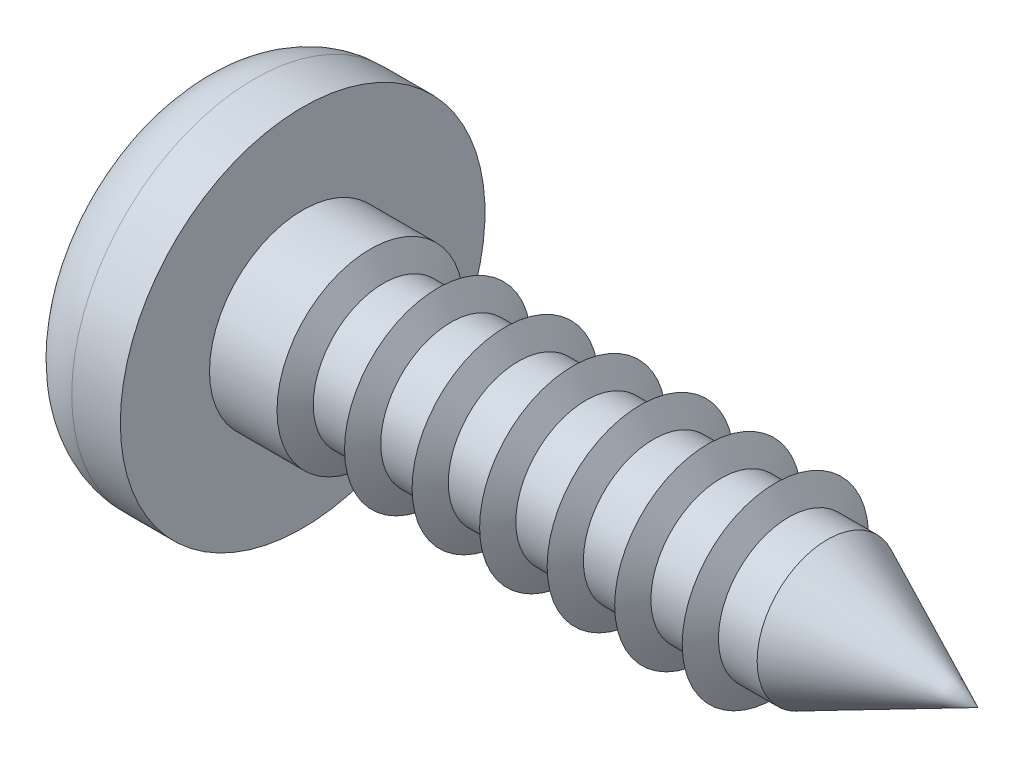
ISO-10303-21;
HEADER;
FILE_DESCRIPTION(('STEP AP214'),'2;1');
FILE_NAME('part.step','',(''),(''),'','','');
FILE_SCHEMA(('AUTOMOTIVE_DESIGN { 1 0 10303 214 1 1 1 1 }'));
ENDSEC;
DATA;
#1=APPLICATION_CONTEXT('core data for automotive mechanical design processes');
#2=APPLICATION_PROTOCOL_DEFINITION('international standard','automotive_design',2000,#1);
#3=PRODUCT_CONTEXT('',#1,'mechanical');
#4=PRODUCT('Part','Part','',(#3));
#5=PRODUCT_RELATED_PRODUCT_CATEGORY('part','',(#4));
#6=PRODUCT_DEFINITION_FORMATION('','',#4);
#7=PRODUCT_DEFINITION_CONTEXT('part definition',#1,'design');
#8=PRODUCT_DEFINITION('design','',#6,#7);
#9=PRODUCT_DEFINITION_SHAPE('','',#8);
#10=(LENGTH_UNIT() NAMED_UNIT(*) SI_UNIT(.MILLI.,.METRE.));
#11=(NAMED_UNIT(*) PLANE_ANGLE_UNIT() SI_UNIT($,.RADIAN.));
#12=(NAMED_UNIT(*) SI_UNIT($,.STERADIAN.) SOLID_ANGLE_UNIT());
#13=UNCERTAINTY_MEASURE_WITH_UNIT(LENGTH_MEASURE(1.E-05),#10,'distance_accuracy_value','');
#14=(GEOMETRIC_REPRESENTATION_CONTEXT(3) GLOBAL_UNCERTAINTY_ASSIGNED_CONTEXT((#13)) GLOBAL_UNIT_ASSIGNED_CONTEXT((#10,
#11,#12)) REPRESENTATION_CONTEXT('',''));
#15=CARTESIAN_POINT('',(0.,0.,0.));
#16=DIRECTION('',(0.,0.,1.));
#17=DIRECTION('',(1.,0.,0.));
#18=AXIS2_PLACEMENT_3D('',#15,#16,#17);
#19=CARTESIAN_POINT('',(7.62,0.,0.));
#20=DIRECTION('',(-1.,0.,0.));
#21=DIRECTION('',(0.,0.,1.));
#22=AXIS2_PLACEMENT_3D('',#19,#20,#21);
#23=CYLINDRICAL_SURFACE('',#22,1.3208);
#24=CARTESIAN_POINT('',(11.2220998462361,0.,0.));
#25=DIRECTION('',(-1.,0.,0.));
#26=DIRECTION('',(0.,0.,1.));
#27=AXIS2_PLACEMENT_3D('',#24,#25,#26);
#28=CIRCLE('',#27,1.3208);
#29=CARTESIAN_POINT('',(11.2220998462361,0.,1.3208));
#30=VERTEX_POINT('',#29);
#31=EDGE_CURVE('E743',#30,#30,#28,.T.);
#32=ORIENTED_EDGE('',*,*,#31,.F.);
#33=EDGE_LOOP('',(#32));
#34=FACE_BOUND('',#33,.T.);
#35=CARTESIAN_POINT('',(11.9503352593909,0.,0.));
#36=DIRECTION('',(-1.,0.,0.));
#37=DIRECTION('',(0.,0.,1.));
#38=AXIS2_PLACEMENT_3D('',#35,#36,#37);
#39=CIRCLE('',#38,1.3208);
#40=CARTESIAN_POINT('',(11.9503352593909,0.,1.3208));
#41=VERTEX_POINT('',#40);
#42=EDGE_CURVE('E78',#41,#41,#39,.T.);
#43=ORIENTED_EDGE('',*,*,#42,.T.);
#44=EDGE_LOOP('',(#43));
#45=FACE_BOUND('',#44,.T.);
#46=ADVANCED_FACE('F74',(#34,#45),#23,.T.);
#47=CARTESIAN_POINT('',(0.,0.,0.));
#48=DIRECTION('',(-1.,0.,0.));
#49=DIRECTION('',(0.,0.,1.));
#50=AXIS2_PLACEMENT_3D('',#47,#48,#49);
#51=CYLINDRICAL_SURFACE('',#50,1.7526);
#52=CARTESIAN_POINT('',(2.0828,0.,0.));
#53=DIRECTION('',(-1.,0.,0.));
#54=DIRECTION('',(0.,0.,1.));
#55=AXIS2_PLACEMENT_3D('',#52,#53,#54);
#56=CIRCLE('',#55,1.7526);
#57=CARTESIAN_POINT('',(2.0828,0.,1.7526));
#58=VERTEX_POINT('',#57);
#59=EDGE_CURVE('E184',#58,#58,#56,.T.);
#60=ORIENTED_EDGE('',*,*,#59,.F.);
#61=EDGE_LOOP('',(#60));
#62=FACE_BOUND('',#61,.T.);
#63=CARTESIAN_POINT('',(3.3528,0.,0.));
#64=DIRECTION('',(-1.,0.,0.));
#65=DIRECTION('',(0.,0.,1.));
#66=AXIS2_PLACEMENT_3D('',#63,#64,#65);
#67=CIRCLE('',#66,1.7526);
#68=CARTESIAN_POINT('',(3.3528,0.,1.7526));
#69=VERTEX_POINT('',#68);
#70=EDGE_CURVE('E188',#69,#69,#67,.T.);
#71=ORIENTED_EDGE('',*,*,#70,.T.);
#72=EDGE_LOOP('',(#71));
#73=FACE_BOUND('',#72,.T.);
#74=ADVANCED_FACE('F325',(#62,#73),#51,.T.);
#75=CARTESIAN_POINT('',(0.,0.,0.));
#76=DIRECTION('',(1.,0.,0.));
#77=DIRECTION('',(0.,0.,-1.));
#78=AXIS2_PLACEMENT_3D('',#75,#76,#77);
#79=PLANE('',#78);
#80=CARTESIAN_POINT('',(0.,0.,0.));
#81=DIRECTION('',(-1.,0.,0.));
#82=DIRECTION('',(0.,0.,1.));
#83=AXIS2_PLACEMENT_3D('',#80,#81,#82);
#84=CIRCLE('',#83,2.2606);
#85=CARTESIAN_POINT('',(0.,0.,2.2606));
#86=VERTEX_POINT('',#85);
#87=EDGE_CURVE('E46',#86,#86,#84,.T.);
#88=ORIENTED_EDGE('',*,*,#87,.T.);
#89=EDGE_LOOP('',(#88));
#90=FACE_BOUND('',#89,.T.);
#91=DIRECTION('',(0.,1.,0.));
#92=VECTOR('',#91,1.);
#93=CARTESIAN_POINT('',(0.,0.4699,-2.1463));
#94=LINE('',#93,#92);
#95=CARTESIAN_POINT('',(0.,-0.4699,-2.1463));
#96=VERTEX_POINT('',#95);
#97=CARTESIAN_POINT('',(0.,0.4699,-2.1463));
#98=VERTEX_POINT('',#97);
#99=EDGE_CURVE('E214',#96,#98,#94,.T.);
#100=ORIENTED_EDGE('',*,*,#99,.T.);
#101=DIRECTION('',(0.,0.,1.));
#102=VECTOR('',#101,1.);
#103=CARTESIAN_POINT('',(0.,0.4699,-0.4699));
#104=LINE('',#103,#102);
#105=CARTESIAN_POINT('',(0.,0.4699,-0.4699));
#106=VERTEX_POINT('',#105);
#107=EDGE_CURVE('E185',#98,#106,#104,.T.);
#108=ORIENTED_EDGE('',*,*,#107,.T.);
#109=DIRECTION('',(0.,1.,0.));
#110=VECTOR('',#109,1.);
#111=CARTESIAN_POINT('',(0.,2.1463,-0.4699));
#112=LINE('',#111,#110);
#113=CARTESIAN_POINT('',(0.,2.1463,-0.4699));
#114=VERTEX_POINT('',#113);
#115=EDGE_CURVE('E93',#106,#114,#112,.T.);
#116=ORIENTED_EDGE('',*,*,#115,.T.);
#117=DIRECTION('',(0.,0.,1.));
#118=VECTOR('',#117,1.);
#119=CARTESIAN_POINT('',(0.,2.1463,-0.4699));
#120=LINE('',#119,#118);
#121=CARTESIAN_POINT('',(0.,2.1463,0.4699));
#122=VERTEX_POINT('',#121);
#123=EDGE_CURVE('E190',#114,#122,#120,.T.);
#124=ORIENTED_EDGE('',*,*,#123,.T.);
#125=DIRECTION('',(0.,-1.,0.));
#126=VECTOR('',#125,1.);
#127=CARTESIAN_POINT('',(0.,2.1463,0.4699));
#128=LINE('',#127,#126);
#129=CARTESIAN_POINT('',(0.,0.4699,0.4699));
#130=VERTEX_POINT('',#129);
#131=EDGE_CURVE('E193',#122,#130,#128,.T.);
#132=ORIENTED_EDGE('',*,*,#131,.T.);
#133=DIRECTION('',(0.,0.,1.));
#134=VECTOR('',#133,1.);
#135=CARTESIAN_POINT('',(0.,0.4699,0.4699));
#136=LINE('',#135,#134);
#137=CARTESIAN_POINT('',(0.,0.4699,2.1463));
#138=VERTEX_POINT('',#137);
#139=EDGE_CURVE('E196',#130,#138,#136,.T.);
#140=ORIENTED_EDGE('',*,*,#139,.T.);
#141=DIRECTION('',(0.,-1.,0.));
#142=VECTOR('',#141,1.);
#143=CARTESIAN_POINT('',(0.,0.4699,2.1463));
#144=LINE('',#143,#142);
#145=CARTESIAN_POINT('',(0.,-0.4699,2.1463));
#146=VERTEX_POINT('',#145);
#147=EDGE_CURVE('E199',#138,#146,#144,.T.);
#148=ORIENTED_EDGE('',*,*,#147,.T.);
#149=DIRECTION('',(0.,0.,-1.));
#150=VECTOR('',#149,1.);
#151=CARTESIAN_POINT('',(0.,-0.4699,0.4699));
#152=LINE('',#151,#150);
#153=CARTESIAN_POINT('',(0.,-0.4699,0.4699));
#154=VERTEX_POINT('',#153);
#155=EDGE_CURVE('E202',#146,#154,#152,.T.);
#156=ORIENTED_EDGE('',*,*,#155,.T.);
#157=DIRECTION('',(0.,-1.,0.));
#158=VECTOR('',#157,1.);
#159=CARTESIAN_POINT('',(0.,-2.1463,0.4699));
#160=LINE('',#159,#158);
#161=CARTESIAN_POINT('',(0.,-2.1463,0.4699));
#162=VERTEX_POINT('',#161);
#163=EDGE_CURVE('E161',#154,#162,#160,.T.);
#164=ORIENTED_EDGE('',*,*,#163,.T.);
#165=DIRECTION('',(0.,0.,-1.));
#166=VECTOR('',#165,1.);
#167=CARTESIAN_POINT('',(0.,-2.1463,-0.4699));
#168=LINE('',#167,#166);
#169=CARTESIAN_POINT('',(0.,-2.1463,-0.4699));
#170=VERTEX_POINT('',#169);
#171=EDGE_CURVE('E205',#162,#170,#168,.T.);
#172=ORIENTED_EDGE('',*,*,#171,.T.);
#173=DIRECTION('',(0.,1.,0.));
#174=VECTOR('',#173,1.);
#175=CARTESIAN_POINT('',(0.,-2.1463,-0.4699));
#176=LINE('',#175,#174);
#177=CARTESIAN_POINT('',(0.,-0.4699,-0.4699));
#178=VERTEX_POINT('',#177);
#179=EDGE_CURVE('E208',#170,#178,#176,.T.);
#180=ORIENTED_EDGE('',*,*,#179,.T.);
#181=DIRECTION('',(0.,0.,-1.));
#182=VECTOR('',#181,1.);
#183=CARTESIAN_POINT('',(0.,-0.4699,-0.4699));
#184=LINE('',#183,#182);
#185=EDGE_CURVE('E211',#178,#96,#184,.T.);
#186=ORIENTED_EDGE('',*,*,#185,.T.);
#187=EDGE_LOOP('',(#100,#108,#116,#124,#132,#140,#148,#156,#164,#172,#180,#186));
#188=FACE_BOUND('',#187,.T.);
#189=ADVANCED_FACE('F261',(#90,#188),#79,.F.);
#190=CARTESIAN_POINT('',(1.1684,0.,0.));
#191=DIRECTION('',(-1.,0.,0.));
#192=DIRECTION('',(0.,0.,1.));
#193=AXIS2_PLACEMENT_3D('',#190,#191,#192);
#194=TOROIDAL_SURFACE('',#193,2.2606,1.1684);
#195=ORIENTED_EDGE('',*,*,#87,.F.);
#196=EDGE_LOOP('',(#195));
#197=FACE_BOUND('',#196,.T.);
#198=CARTESIAN_POINT('',(1.1684,0.,0.));
#199=DIRECTION('',(-1.,0.,0.));
#200=DIRECTION('',(0.,0.,1.));
#201=AXIS2_PLACEMENT_3D('',#198,#199,#200);
#202=CIRCLE('',#201,3.429);
#203=CARTESIAN_POINT('',(1.1684,0.,3.429));
#204=VERTEX_POINT('',#203);
#205=EDGE_CURVE('E84',#204,#204,#202,.T.);
#206=ORIENTED_EDGE('',*,*,#205,.T.);
#207=EDGE_LOOP('',(#206));
#208=FACE_BOUND('',#207,.T.);
#209=ADVANCED_FACE('F433',(#197,#208),#194,.T.);
#210=CARTESIAN_POINT('',(0.,0.,0.));
#211=DIRECTION('',(-1.,0.,0.));
#212=DIRECTION('',(0.,0.,1.));
#213=AXIS2_PLACEMENT_3D('',#210,#211,#212);
#214=CYLINDRICAL_SURFACE('',#213,3.429);
#215=ORIENTED_EDGE('',*,*,#205,.F.);
#216=EDGE_LOOP('',(#215));
#217=FACE_BOUND('',#216,.T.);
#218=CARTESIAN_POINT('',(2.0828,0.,0.));
#219=DIRECTION('',(-1.,0.,0.));
#220=DIRECTION('',(0.,0.,1.));
#221=AXIS2_PLACEMENT_3D('',#218,#219,#220);
#222=CIRCLE('',#221,3.429);
#223=CARTESIAN_POINT('',(2.0828,0.,3.429));
#224=VERTEX_POINT('',#223);
#225=EDGE_CURVE('E233',#224,#224,#222,.T.);
#226=ORIENTED_EDGE('',*,*,#225,.T.);
#227=EDGE_LOOP('',(#226));
#228=FACE_BOUND('',#227,.T.);
#229=ADVANCED_FACE('F429',(#217,#228),#214,.T.);
#230=CARTESIAN_POINT('',(2.0828,1.7526,0.));
#231=DIRECTION('',(-1.,0.,0.));
#232=DIRECTION('',(0.,0.,1.));
#233=AXIS2_PLACEMENT_3D('',#230,#231,#232);
#234=PLANE('',#233);
#235=ORIENTED_EDGE('',*,*,#225,.F.);
#236=EDGE_LOOP('',(#235));
#237=FACE_BOUND('',#236,.T.);
#238=ORIENTED_EDGE('',*,*,#59,.T.);
#239=EDGE_LOOP('',(#238));
#240=FACE_BOUND('',#239,.T.);
#241=ADVANCED_FACE('F426',(#237,#240),#234,.F.);
#242=CARTESIAN_POINT('',(0.,0.4699,-2.1463));
#243=DIRECTION('',(-0.342020143325669,0.,0.939692620785908));
#244=DIRECTION('',(0.939692620785908,0.,0.342020143325669));
#245=AXIS2_PLACEMENT_3D('',#242,#243,#244);
#246=PLANE('',#245);
#247=DIRECTION('',(-0.939692620785908,0.,-0.342020143325669));
#248=VECTOR('',#247,1.);
#249=CARTESIAN_POINT('',(7.73846487759835,0.4699,0.670270874360255));
#250=LINE('',#249,#248);
#251=CARTESIAN_POINT('',(2.0574,0.4699,-1.39746764002071));
#252=VERTEX_POINT('',#251);
#253=EDGE_CURVE('E217',#252,#98,#250,.T.);
#254=ORIENTED_EDGE('',*,*,#253,.T.);
#255=ORIENTED_EDGE('',*,*,#99,.F.);
#256=DIRECTION('',(-0.939692620785908,0.,-0.342020143325669));
#257=VECTOR('',#256,1.);
#258=CARTESIAN_POINT('',(0.,-0.4699,-2.1463));
#259=LINE('',#258,#257);
#260=CARTESIAN_POINT('',(2.0574,-0.4699,-1.39746764002071));
#261=VERTEX_POINT('',#260);
#262=EDGE_CURVE('E220',#261,#96,#259,.T.);
#263=ORIENTED_EDGE('',*,*,#262,.F.);
#264=DIRECTION('',(0.,-1.,0.));
#265=VECTOR('',#264,1.);
#266=CARTESIAN_POINT('',(2.0574,0.4699,-1.39746764002071));
#267=LINE('',#266,#265);
#268=EDGE_CURVE('E229',#252,#261,#267,.T.);
#269=ORIENTED_EDGE('',*,*,#268,.F.);
#270=EDGE_LOOP('',(#254,#255,#263,#269));
#271=FACE_BOUND('',#270,.T.);
#272=ADVANCED_FACE('F280',(#271),#246,.T.);
#273=CARTESIAN_POINT('',(8.15345313784275,-0.4699,-0.4699));
#274=DIRECTION('',(0.,1.,0.));
#275=DIRECTION('',(0.,0.,1.));
#276=AXIS2_PLACEMENT_3D('',#273,#274,#275);
#277=PLANE('',#276);
#278=ORIENTED_EDGE('',*,*,#262,.T.);
#279=ORIENTED_EDGE('',*,*,#185,.F.);
#280=DIRECTION('',(-1.,0.,0.));
#281=VECTOR('',#280,1.);
#282=CARTESIAN_POINT('',(8.15345313784275,-0.4699,-0.4699));
#283=LINE('',#282,#281);
#284=CARTESIAN_POINT('',(2.0574,-0.4699,-0.4699));
#285=VERTEX_POINT('',#284);
#286=EDGE_CURVE('E218',#285,#178,#283,.T.);
#287=ORIENTED_EDGE('',*,*,#286,.F.);
#288=DIRECTION('',(0.,0.,1.));
#289=VECTOR('',#288,1.);
#290=CARTESIAN_POINT('',(2.0574,-0.4699,-0.4699));
#291=LINE('',#290,#289);
#292=EDGE_CURVE('E242',#261,#285,#291,.T.);
#293=ORIENTED_EDGE('',*,*,#292,.F.);
#294=EDGE_LOOP('',(#278,#279,#287,#293));
#295=FACE_BOUND('',#294,.T.);
#296=ADVANCED_FACE('F287',(#295),#277,.T.);
#297=CARTESIAN_POINT('',(8.15345313784275,-2.1463,-0.4699));
#298=DIRECTION('',(0.,0.,1.));
#299=DIRECTION('',(0.,-1.,0.));
#300=AXIS2_PLACEMENT_3D('',#297,#298,#299);
#301=PLANE('',#300);
#302=ORIENTED_EDGE('',*,*,#286,.T.);
#303=ORIENTED_EDGE('',*,*,#179,.F.);
#304=DIRECTION('',(-0.939692620785908,-0.342020143325669,0.));
#305=VECTOR('',#304,1.);
#306=CARTESIAN_POINT('',(7.19968030315909,0.474169326582581,-0.4699));
#307=LINE('',#306,#305);
#308=CARTESIAN_POINT('',(2.0574,-1.39746764002071,-0.4699));
#309=VERTEX_POINT('',#308);
#310=EDGE_CURVE('E219',#309,#170,#307,.T.);
#311=ORIENTED_EDGE('',*,*,#310,.F.);
#312=DIRECTION('',(0.,-1.,0.));
#313=VECTOR('',#312,1.);
#314=CARTESIAN_POINT('',(2.0574,-2.1463,-0.4699));
#315=LINE('',#314,#313);
#316=EDGE_CURVE('E133',#285,#309,#315,.T.);
#317=ORIENTED_EDGE('',*,*,#316,.F.);
#318=EDGE_LOOP('',(#302,#303,#311,#317));
#319=FACE_BOUND('',#318,.T.);
#320=ADVANCED_FACE('F410',(#319),#301,.T.);
#321=CARTESIAN_POINT('',(0.,-2.1463,-0.4699));
#322=DIRECTION('',(-0.342020143325669,0.939692620785908,0.));
#323=DIRECTION('',(-0.939692620785908,-0.342020143325669,0.));
#324=AXIS2_PLACEMENT_3D('',#321,#322,#323);
#325=PLANE('',#324);
#326=ORIENTED_EDGE('',*,*,#310,.T.);
#327=ORIENTED_EDGE('',*,*,#171,.F.);
#328=DIRECTION('',(-0.939692620785908,-0.342020143325669,0.));
#329=VECTOR('',#328,1.);
#330=CARTESIAN_POINT('',(0.,-2.1463,0.4699));
#331=LINE('',#330,#329);
#332=CARTESIAN_POINT('',(2.0574,-1.39746764002071,0.4699));
#333=VERTEX_POINT('',#332);
#334=EDGE_CURVE('E163',#333,#162,#331,.T.);
#335=ORIENTED_EDGE('',*,*,#334,.F.);
#336=DIRECTION('',(0.,0.,1.));
#337=VECTOR('',#336,1.);
#338=CARTESIAN_POINT('',(2.0574,-1.39746764002071,-0.4699));
#339=LINE('',#338,#337);
#340=EDGE_CURVE('E125',#309,#333,#339,.T.);
#341=ORIENTED_EDGE('',*,*,#340,.F.);
#342=EDGE_LOOP('',(#326,#327,#335,#341));
#343=FACE_BOUND('',#342,.T.);
#344=ADVANCED_FACE('F258',(#343),#325,.T.);
#345=CARTESIAN_POINT('',(8.15345313784275,-2.1463,0.4699));
#346=DIRECTION('',(0.,0.,-1.));
#347=DIRECTION('',(0.,1.,0.));
#348=AXIS2_PLACEMENT_3D('',#345,#346,#347);
#349=PLANE('',#348);
#350=ORIENTED_EDGE('',*,*,#334,.T.);
#351=ORIENTED_EDGE('',*,*,#163,.F.);
#352=DIRECTION('',(-1.,0.,0.));
#353=VECTOR('',#352,1.);
#354=CARTESIAN_POINT('',(8.15345313784275,-0.4699,0.4699));
#355=LINE('',#354,#353);
#356=CARTESIAN_POINT('',(2.0574,-0.4699,0.4699));
#357=VERTEX_POINT('',#356);
#358=EDGE_CURVE('E147',#357,#154,#355,.T.);
#359=ORIENTED_EDGE('',*,*,#358,.F.);
#360=DIRECTION('',(0.,1.,0.));
#361=VECTOR('',#360,1.);
#362=CARTESIAN_POINT('',(2.0574,-2.1463,0.4699));
#363=LINE('',#362,#361);
#364=EDGE_CURVE('E155',#333,#357,#363,.T.);
#365=ORIENTED_EDGE('',*,*,#364,.F.);
#366=EDGE_LOOP('',(#350,#351,#359,#365));
#367=FACE_BOUND('',#366,.T.);
#368=ADVANCED_FACE('F159',(#367),#349,.T.);
#369=CARTESIAN_POINT('',(8.15345313784275,-0.4699,0.4699));
#370=DIRECTION('',(0.,1.,0.));
#371=DIRECTION('',(0.,0.,1.));
#372=AXIS2_PLACEMENT_3D('',#369,#370,#371);
#373=PLANE('',#372);
#374=ORIENTED_EDGE('',*,*,#358,.T.);
#375=ORIENTED_EDGE('',*,*,#155,.F.);
#376=DIRECTION('',(-0.939692620785908,0.,0.342020143325669));
#377=VECTOR('',#376,1.);
#378=CARTESIAN_POINT('',(7.73846487759835,-0.4699,-0.670270874360255));
#379=LINE('',#378,#377);
#380=CARTESIAN_POINT('',(2.0574,-0.4699,1.39746764002071));
#381=VERTEX_POINT('',#380);
#382=EDGE_CURVE('E150',#381,#146,#379,.T.);
#383=ORIENTED_EDGE('',*,*,#382,.F.);
#384=DIRECTION('',(0.,0.,1.));
#385=VECTOR('',#384,1.);
#386=CARTESIAN_POINT('',(2.0574,-0.4699,0.4699));
#387=LINE('',#386,#385);
#388=EDGE_CURVE('E142',#357,#381,#387,.T.);
#389=ORIENTED_EDGE('',*,*,#388,.F.);
#390=EDGE_LOOP('',(#374,#375,#383,#389));
#391=FACE_BOUND('',#390,.T.);
#392=ADVANCED_FACE('F144',(#391),#373,.T.);
#393=CARTESIAN_POINT('',(0.,0.4699,2.1463));
#394=DIRECTION('',(-0.342020143325669,0.,-0.939692620785908));
#395=DIRECTION('',(-0.939692620785908,0.,0.342020143325669));
#396=AXIS2_PLACEMENT_3D('',#393,#394,#395);
#397=PLANE('',#396);
#398=ORIENTED_EDGE('',*,*,#382,.T.);
#399=ORIENTED_EDGE('',*,*,#147,.F.);
#400=DIRECTION('',(-0.939692620785908,0.,0.342020143325669));
#401=VECTOR('',#400,1.);
#402=CARTESIAN_POINT('',(0.,0.4699,2.1463));
#403=LINE('',#402,#401);
#404=CARTESIAN_POINT('',(2.0574,0.4699,1.39746764002071));
#405=VERTEX_POINT('',#404);
#406=EDGE_CURVE('E226',#405,#138,#403,.T.);
#407=ORIENTED_EDGE('',*,*,#406,.F.);
#408=DIRECTION('',(0.,1.,0.));
#409=VECTOR('',#408,1.);
#410=CARTESIAN_POINT('',(2.0574,0.4699,1.39746764002071));
#411=LINE('',#410,#409);
#412=EDGE_CURVE('E154',#381,#405,#411,.T.);
#413=ORIENTED_EDGE('',*,*,#412,.F.);
#414=EDGE_LOOP('',(#398,#399,#407,#413));
#415=FACE_BOUND('',#414,.T.);
#416=ADVANCED_FACE('F417',(#415),#397,.T.);
#417=CARTESIAN_POINT('',(8.15345313784275,0.4699,0.4699));
#418=DIRECTION('',(0.,-1.,0.));
#419=DIRECTION('',(0.,0.,-1.));
#420=AXIS2_PLACEMENT_3D('',#417,#418,#419);
#421=PLANE('',#420);
#422=ORIENTED_EDGE('',*,*,#406,.T.);
#423=ORIENTED_EDGE('',*,*,#139,.F.);
#424=DIRECTION('',(-1.,0.,0.));
#425=VECTOR('',#424,1.);
#426=CARTESIAN_POINT('',(8.15345313784275,0.4699,0.4699));
#427=LINE('',#426,#425);
#428=CARTESIAN_POINT('',(2.0574,0.4699,0.4699));
#429=VERTEX_POINT('',#428);
#430=EDGE_CURVE('E222',#429,#130,#427,.T.);
#431=ORIENTED_EDGE('',*,*,#430,.F.);
#432=DIRECTION('',(0.,0.,-1.));
#433=VECTOR('',#432,1.);
#434=CARTESIAN_POINT('',(2.0574,0.4699,0.4699));
#435=LINE('',#434,#433);
#436=EDGE_CURVE('E172',#405,#429,#435,.T.);
#437=ORIENTED_EDGE('',*,*,#436,.F.);
#438=EDGE_LOOP('',(#422,#423,#431,#437));
#439=FACE_BOUND('',#438,.T.);
#440=ADVANCED_FACE('F302',(#439),#421,.T.);
#441=CARTESIAN_POINT('',(8.15345313784275,2.1463,0.4699));
#442=DIRECTION('',(0.,0.,-1.));
#443=DIRECTION('',(-1.,0.,0.));
#444=AXIS2_PLACEMENT_3D('',#441,#442,#443);
#445=PLANE('',#444);
#446=ORIENTED_EDGE('',*,*,#430,.T.);
#447=ORIENTED_EDGE('',*,*,#131,.F.);
#448=DIRECTION('',(-0.939692620785908,0.342020143325669,0.));
#449=VECTOR('',#448,1.);
#450=CARTESIAN_POINT('',(7.19968030315909,-0.474169326582581,0.4699));
#451=LINE('',#450,#449);
#452=CARTESIAN_POINT('',(2.0574,1.39746764002071,0.4699));
#453=VERTEX_POINT('',#452);
#454=EDGE_CURVE('E225',#453,#122,#451,.T.);
#455=ORIENTED_EDGE('',*,*,#454,.F.);
#456=DIRECTION('',(0.,1.,0.));
#457=VECTOR('',#456,1.);
#458=CARTESIAN_POINT('',(2.0574,2.1463,0.4699));
#459=LINE('',#458,#457);
#460=EDGE_CURVE('E175',#429,#453,#459,.T.);
#461=ORIENTED_EDGE('',*,*,#460,.F.);
#462=EDGE_LOOP('',(#446,#447,#455,#461));
#463=FACE_BOUND('',#462,.T.);
#464=ADVANCED_FACE('F298',(#463),#445,.T.);
#465=CARTESIAN_POINT('',(0.,2.1463,-0.4699));
#466=DIRECTION('',(-0.342020143325669,-0.939692620785908,0.));
#467=DIRECTION('',(0.939692620785908,-0.342020143325669,0.));
#468=AXIS2_PLACEMENT_3D('',#465,#466,#467);
#469=PLANE('',#468);
#470=ORIENTED_EDGE('',*,*,#454,.T.);
#471=ORIENTED_EDGE('',*,*,#123,.F.);
#472=DIRECTION('',(-0.939692620785908,0.342020143325669,0.));
#473=VECTOR('',#472,1.);
#474=CARTESIAN_POINT('',(0.,2.1463,-0.4699));
#475=LINE('',#474,#473);
#476=CARTESIAN_POINT('',(2.0574,1.39746764002071,-0.4699));
#477=VERTEX_POINT('',#476);
#478=EDGE_CURVE('E230',#477,#114,#475,.T.);
#479=ORIENTED_EDGE('',*,*,#478,.F.);
#480=DIRECTION('',(0.,0.,-1.));
#481=VECTOR('',#480,1.);
#482=CARTESIAN_POINT('',(2.0574,1.39746764002071,-0.4699));
#483=LINE('',#482,#481);
#484=EDGE_CURVE('E178',#453,#477,#483,.T.);
#485=ORIENTED_EDGE('',*,*,#484,.F.);
#486=EDGE_LOOP('',(#470,#471,#479,#485));
#487=FACE_BOUND('',#486,.T.);
#488=ADVANCED_FACE('F76',(#487),#469,.T.);
#489=CARTESIAN_POINT('',(8.15345313784275,2.1463,-0.4699));
#490=DIRECTION('',(0.,0.,1.));
#491=DIRECTION('',(1.,0.,0.));
#492=AXIS2_PLACEMENT_3D('',#489,#490,#491);
#493=PLANE('',#492);
#494=ORIENTED_EDGE('',*,*,#478,.T.);
#495=ORIENTED_EDGE('',*,*,#115,.F.);
#496=DIRECTION('',(-1.,0.,0.));
#497=VECTOR('',#496,1.);
#498=CARTESIAN_POINT('',(8.15345313784275,0.4699,-0.4699));
#499=LINE('',#498,#497);
#500=CARTESIAN_POINT('',(2.0574,0.4699,-0.4699));
#501=VERTEX_POINT('',#500);
#502=EDGE_CURVE('E227',#501,#106,#499,.T.);
#503=ORIENTED_EDGE('',*,*,#502,.F.);
#504=DIRECTION('',(0.,-1.,0.));
#505=VECTOR('',#504,1.);
#506=CARTESIAN_POINT('',(2.0574,2.1463,-0.4699));
#507=LINE('',#506,#505);
#508=EDGE_CURVE('E179',#477,#501,#507,.T.);
#509=ORIENTED_EDGE('',*,*,#508,.F.);
#510=EDGE_LOOP('',(#494,#495,#503,#509));
#511=FACE_BOUND('',#510,.T.);
#512=ADVANCED_FACE('F289',(#511),#493,.T.);
#513=CARTESIAN_POINT('',(8.15345313784275,0.4699,-0.4699));
#514=DIRECTION('',(0.,-1.,0.));
#515=DIRECTION('',(0.,0.,-1.));
#516=AXIS2_PLACEMENT_3D('',#513,#514,#515);
#517=PLANE('',#516);
#518=ORIENTED_EDGE('',*,*,#502,.T.);
#519=ORIENTED_EDGE('',*,*,#107,.F.);
#520=ORIENTED_EDGE('',*,*,#253,.F.);
#521=DIRECTION('',(0.,0.,-1.));
#522=VECTOR('',#521,1.);
#523=CARTESIAN_POINT('',(2.0574,0.4699,-0.4699));
#524=LINE('',#523,#522);
#525=EDGE_CURVE('E181',#501,#252,#524,.T.);
#526=ORIENTED_EDGE('',*,*,#525,.F.);
#527=EDGE_LOOP('',(#518,#519,#520,#526));
#528=FACE_BOUND('',#527,.T.);
#529=ADVANCED_FACE('F284',(#528),#517,.T.);
#530=CARTESIAN_POINT('',(2.0574,1.7526,0.));
#531=DIRECTION('',(-1.,0.,0.));
#532=DIRECTION('',(0.,0.,1.));
#533=AXIS2_PLACEMENT_3D('',#530,#531,#532);
#534=PLANE('',#533);
#535=ORIENTED_EDGE('',*,*,#508,.T.);
#536=ORIENTED_EDGE('',*,*,#525,.T.);
#537=ORIENTED_EDGE('',*,*,#268,.T.);
#538=ORIENTED_EDGE('',*,*,#292,.T.);
#539=ORIENTED_EDGE('',*,*,#316,.T.);
#540=ORIENTED_EDGE('',*,*,#340,.T.);
#541=ORIENTED_EDGE('',*,*,#364,.T.);
#542=ORIENTED_EDGE('',*,*,#388,.T.);
#543=ORIENTED_EDGE('',*,*,#412,.T.);
#544=ORIENTED_EDGE('',*,*,#436,.T.);
#545=ORIENTED_EDGE('',*,*,#460,.T.);
#546=ORIENTED_EDGE('',*,*,#484,.T.);
#547=EDGE_LOOP('',(#535,#536,#537,#538,#539,#540,#541,#542,#543,#544,#545,#546));
#548=FACE_BOUND('',#547,.T.);
#549=ADVANCED_FACE('F166',(#548),#534,.T.);
#550=CARTESIAN_POINT('',(3.3528,0.,0.));
#551=DIRECTION('',(-1.,0.,0.));
#552=DIRECTION('',(0.,0.,1.));
#553=AXIS2_PLACEMENT_3D('',#550,#551,#552);
#554=CONICAL_SURFACE('',#553,1.7526,1.04719755119659);
#555=CARTESIAN_POINT('',(3.60209984623608,0.,0.));
#556=DIRECTION('',(-1.,0.,0.));
#557=DIRECTION('',(0.,0.,1.));
#558=AXIS2_PLACEMENT_3D('',#555,#556,#557);
#559=CIRCLE('',#558,1.3208);
#560=CARTESIAN_POINT('',(3.60209984623608,0.,1.3208));
#561=VERTEX_POINT('',#560);
#562=EDGE_CURVE('E687',#561,#561,#559,.T.);
#563=ORIENTED_EDGE('',*,*,#562,.T.);
#564=EDGE_LOOP('',(#563));
#565=FACE_BOUND('',#564,.T.);
#566=ORIENTED_EDGE('',*,*,#70,.F.);
#567=EDGE_LOOP('',(#566));
#568=FACE_BOUND('',#567,.T.);
#569=ADVANCED_FACE('F401',(#565,#568),#554,.T.);
#570=CARTESIAN_POINT('',(0.,0.,0.));
#571=DIRECTION('',(-1.,0.,0.));
#572=DIRECTION('',(0.,0.,1.));
#573=AXIS2_PLACEMENT_3D('',#570,#571,#572);
#574=CYLINDRICAL_SURFACE('',#573,1.3208);
#575=CARTESIAN_POINT('',(4.37350015376392,0.,0.));
#576=DIRECTION('',(-1.,0.,0.));
#577=DIRECTION('',(0.,0.,1.));
#578=AXIS2_PLACEMENT_3D('',#575,#576,#577);
#579=CIRCLE('',#578,1.3208);
#580=CARTESIAN_POINT('',(4.37350015376392,0.,1.3208));
#581=VERTEX_POINT('',#580);
#582=EDGE_CURVE('E690',#581,#581,#579,.T.);
#583=ORIENTED_EDGE('',*,*,#582,.T.);
#584=EDGE_LOOP('',(#583));
#585=FACE_BOUND('',#584,.T.);
#586=ORIENTED_EDGE('',*,*,#562,.F.);
#587=EDGE_LOOP('',(#586));
#588=FACE_BOUND('',#587,.T.);
#589=ADVANCED_FACE('F397',(#585,#588),#574,.T.);
#590=CARTESIAN_POINT('',(4.37350015376392,0.,0.));
#591=DIRECTION('',(1.,0.,0.));
#592=DIRECTION('',(0.,0.,-1.));
#593=AXIS2_PLACEMENT_3D('',#590,#591,#592);
#594=CONICAL_SURFACE('',#593,1.3208,1.04719755119659);
#595=CARTESIAN_POINT('',(4.6228,0.,0.));
#596=DIRECTION('',(-1.,0.,0.));
#597=DIRECTION('',(0.,0.,1.));
#598=AXIS2_PLACEMENT_3D('',#595,#596,#597);
#599=CIRCLE('',#598,1.7526);
#600=CARTESIAN_POINT('',(4.6228,0.,1.7526));
#601=VERTEX_POINT('',#600);
#602=EDGE_CURVE('E695',#601,#601,#599,.T.);
#603=ORIENTED_EDGE('',*,*,#602,.T.);
#604=EDGE_LOOP('',(#603));
#605=FACE_BOUND('',#604,.T.);
#606=ORIENTED_EDGE('',*,*,#582,.F.);
#607=EDGE_LOOP('',(#606));
#608=FACE_BOUND('',#607,.T.);
#609=ADVANCED_FACE('F393',(#605,#608),#594,.T.);
#610=CARTESIAN_POINT('',(4.6228,0.,0.));
#611=DIRECTION('',(-1.,0.,0.));
#612=DIRECTION('',(0.,0.,1.));
#613=AXIS2_PLACEMENT_3D('',#610,#611,#612);
#614=CONICAL_SURFACE('',#613,1.7526,1.04719755119659);
#615=CARTESIAN_POINT('',(4.87209984623608,0.,0.));
#616=DIRECTION('',(-1.,0.,0.));
#617=DIRECTION('',(0.,0.,1.));
#618=AXIS2_PLACEMENT_3D('',#615,#616,#617);
#619=CIRCLE('',#618,1.3208);
#620=CARTESIAN_POINT('',(4.87209984623608,0.,1.3208));
#621=VERTEX_POINT('',#620);
#622=EDGE_CURVE('E698',#621,#621,#619,.T.);
#623=ORIENTED_EDGE('',*,*,#622,.T.);
#624=EDGE_LOOP('',(#623));
#625=FACE_BOUND('',#624,.T.);
#626=ORIENTED_EDGE('',*,*,#602,.F.);
#627=EDGE_LOOP('',(#626));
#628=FACE_BOUND('',#627,.T.);
#629=ADVANCED_FACE('F389',(#625,#628),#614,.T.);
#630=CARTESIAN_POINT('',(1.27,0.,0.));
#631=DIRECTION('',(-1.,0.,0.));
#632=DIRECTION('',(0.,0.,1.));
#633=AXIS2_PLACEMENT_3D('',#630,#631,#632);
#634=CYLINDRICAL_SURFACE('',#633,1.3208);
#635=CARTESIAN_POINT('',(5.64350015376392,0.,0.));
#636=DIRECTION('',(-1.,0.,0.));
#637=DIRECTION('',(0.,0.,1.));
#638=AXIS2_PLACEMENT_3D('',#635,#636,#637);
#639=CIRCLE('',#638,1.3208);
#640=CARTESIAN_POINT('',(5.64350015376392,0.,1.3208));
#641=VERTEX_POINT('',#640);
#642=EDGE_CURVE('E701',#641,#641,#639,.T.);
#643=ORIENTED_EDGE('',*,*,#642,.T.);
#644=EDGE_LOOP('',(#643));
#645=FACE_BOUND('',#644,.T.);
#646=ORIENTED_EDGE('',*,*,#622,.F.);
#647=EDGE_LOOP('',(#646));
#648=FACE_BOUND('',#647,.T.);
#649=ADVANCED_FACE('F385',(#645,#648),#634,.T.);
#650=CARTESIAN_POINT('',(5.64350015376392,0.,0.));
#651=DIRECTION('',(1.,0.,0.));
#652=DIRECTION('',(0.,0.,-1.));
#653=AXIS2_PLACEMENT_3D('',#650,#651,#652);
#654=CONICAL_SURFACE('',#653,1.3208,1.04719755119659);
#655=CARTESIAN_POINT('',(5.8928,0.,0.));
#656=DIRECTION('',(-1.,0.,0.));
#657=DIRECTION('',(0.,0.,1.));
#658=AXIS2_PLACEMENT_3D('',#655,#656,#657);
#659=CIRCLE('',#658,1.7526);
#660=CARTESIAN_POINT('',(5.8928,0.,1.7526));
#661=VERTEX_POINT('',#660);
#662=EDGE_CURVE('E704',#661,#661,#659,.T.);
#663=ORIENTED_EDGE('',*,*,#662,.T.);
#664=EDGE_LOOP('',(#663));
#665=FACE_BOUND('',#664,.T.);
#666=ORIENTED_EDGE('',*,*,#642,.F.);
#667=EDGE_LOOP('',(#666));
#668=FACE_BOUND('',#667,.T.);
#669=ADVANCED_FACE('F381',(#665,#668),#654,.T.);
#670=CARTESIAN_POINT('',(5.8928,0.,0.));
#671=DIRECTION('',(-1.,0.,0.));
#672=DIRECTION('',(0.,0.,1.));
#673=AXIS2_PLACEMENT_3D('',#670,#671,#672);
#674=CONICAL_SURFACE('',#673,1.7526,1.04719755119659);
#675=CARTESIAN_POINT('',(6.14209984623608,0.,0.));
#676=DIRECTION('',(-1.,0.,0.));
#677=DIRECTION('',(0.,0.,1.));
#678=AXIS2_PLACEMENT_3D('',#675,#676,#677);
#679=CIRCLE('',#678,1.3208);
#680=CARTESIAN_POINT('',(6.14209984623608,0.,1.3208));
#681=VERTEX_POINT('',#680);
#682=EDGE_CURVE('E707',#681,#681,#679,.T.);
#683=ORIENTED_EDGE('',*,*,#682,.T.);
#684=EDGE_LOOP('',(#683));
#685=FACE_BOUND('',#684,.T.);
#686=ORIENTED_EDGE('',*,*,#662,.F.);
#687=EDGE_LOOP('',(#686));
#688=FACE_BOUND('',#687,.T.);
#689=ADVANCED_FACE('F377',(#685,#688),#674,.T.);
#690=CARTESIAN_POINT('',(2.54,0.,0.));
#691=DIRECTION('',(-1.,0.,0.));
#692=DIRECTION('',(0.,0.,1.));
#693=AXIS2_PLACEMENT_3D('',#690,#691,#692);
#694=CYLINDRICAL_SURFACE('',#693,1.3208);
#695=CARTESIAN_POINT('',(6.91350015376392,0.,0.));
#696=DIRECTION('',(-1.,0.,0.));
#697=DIRECTION('',(0.,0.,1.));
#698=AXIS2_PLACEMENT_3D('',#695,#696,#697);
#699=CIRCLE('',#698,1.3208);
#700=CARTESIAN_POINT('',(6.91350015376392,0.,1.3208));
#701=VERTEX_POINT('',#700);
#702=EDGE_CURVE('E710',#701,#701,#699,.T.);
#703=ORIENTED_EDGE('',*,*,#702,.T.);
#704=EDGE_LOOP('',(#703));
#705=FACE_BOUND('',#704,.T.);
#706=ORIENTED_EDGE('',*,*,#682,.F.);
#707=EDGE_LOOP('',(#706));
#708=FACE_BOUND('',#707,.T.);
#709=ADVANCED_FACE('F373',(#705,#708),#694,.T.);
#710=CARTESIAN_POINT('',(6.91350015376392,0.,0.));
#711=DIRECTION('',(1.,0.,0.));
#712=DIRECTION('',(0.,0.,-1.));
#713=AXIS2_PLACEMENT_3D('',#710,#711,#712);
#714=CONICAL_SURFACE('',#713,1.3208,1.04719755119659);
#715=CARTESIAN_POINT('',(7.1628,0.,0.));
#716=DIRECTION('',(-1.,0.,0.));
#717=DIRECTION('',(0.,0.,1.));
#718=AXIS2_PLACEMENT_3D('',#715,#716,#717);
#719=CIRCLE('',#718,1.7526);
#720=CARTESIAN_POINT('',(7.1628,0.,1.7526));
#721=VERTEX_POINT('',#720);
#722=EDGE_CURVE('E713',#721,#721,#719,.T.);
#723=ORIENTED_EDGE('',*,*,#722,.T.);
#724=EDGE_LOOP('',(#723));
#725=FACE_BOUND('',#724,.T.);
#726=ORIENTED_EDGE('',*,*,#702,.F.);
#727=EDGE_LOOP('',(#726));
#728=FACE_BOUND('',#727,.T.);
#729=ADVANCED_FACE('F369',(#725,#728),#714,.T.);
#730=CARTESIAN_POINT('',(7.1628,0.,0.));
#731=DIRECTION('',(-1.,0.,0.));
#732=DIRECTION('',(0.,0.,1.));
#733=AXIS2_PLACEMENT_3D('',#730,#731,#732);
#734=CONICAL_SURFACE('',#733,1.7526,1.04719755119659);
#735=CARTESIAN_POINT('',(7.41209984623608,0.,0.));
#736=DIRECTION('',(-1.,0.,0.));
#737=DIRECTION('',(0.,0.,1.));
#738=AXIS2_PLACEMENT_3D('',#735,#736,#737);
#739=CIRCLE('',#738,1.3208);
#740=CARTESIAN_POINT('',(7.41209984623608,0.,1.3208));
#741=VERTEX_POINT('',#740);
#742=EDGE_CURVE('E716',#741,#741,#739,.T.);
#743=ORIENTED_EDGE('',*,*,#742,.T.);
#744=EDGE_LOOP('',(#743));
#745=FACE_BOUND('',#744,.T.);
#746=ORIENTED_EDGE('',*,*,#722,.F.);
#747=EDGE_LOOP('',(#746));
#748=FACE_BOUND('',#747,.T.);
#749=ADVANCED_FACE('F365',(#745,#748),#734,.T.);
#750=CARTESIAN_POINT('',(3.81,0.,0.));
#751=DIRECTION('',(-1.,0.,0.));
#752=DIRECTION('',(0.,0.,1.));
#753=AXIS2_PLACEMENT_3D('',#750,#751,#752);
#754=CYLINDRICAL_SURFACE('',#753,1.3208);
#755=CARTESIAN_POINT('',(8.18350015376392,0.,0.));
#756=DIRECTION('',(-1.,0.,0.));
#757=DIRECTION('',(0.,0.,1.));
#758=AXIS2_PLACEMENT_3D('',#755,#756,#757);
#759=CIRCLE('',#758,1.3208);
#760=CARTESIAN_POINT('',(8.18350015376392,0.,1.3208));
#761=VERTEX_POINT('',#760);
#762=EDGE_CURVE('E719',#761,#761,#759,.T.);
#763=ORIENTED_EDGE('',*,*,#762,.T.);
#764=EDGE_LOOP('',(#763));
#765=FACE_BOUND('',#764,.T.);
#766=ORIENTED_EDGE('',*,*,#742,.F.);
#767=EDGE_LOOP('',(#766));
#768=FACE_BOUND('',#767,.T.);
#769=ADVANCED_FACE('F361',(#765,#768),#754,.T.);
#770=CARTESIAN_POINT('',(8.18350015376392,0.,0.));
#771=DIRECTION('',(1.,0.,0.));
#772=DIRECTION('',(0.,0.,-1.));
#773=AXIS2_PLACEMENT_3D('',#770,#771,#772);
#774=CONICAL_SURFACE('',#773,1.3208,1.04719755119659);
#775=CARTESIAN_POINT('',(8.4328,0.,0.));
#776=DIRECTION('',(-1.,0.,0.));
#777=DIRECTION('',(0.,0.,1.));
#778=AXIS2_PLACEMENT_3D('',#775,#776,#777);
#779=CIRCLE('',#778,1.7526);
#780=CARTESIAN_POINT('',(8.4328,0.,1.7526));
#781=VERTEX_POINT('',#780);
#782=EDGE_CURVE('E722',#781,#781,#779,.T.);
#783=ORIENTED_EDGE('',*,*,#782,.T.);
#784=EDGE_LOOP('',(#783));
#785=FACE_BOUND('',#784,.T.);
#786=ORIENTED_EDGE('',*,*,#762,.F.);
#787=EDGE_LOOP('',(#786));
#788=FACE_BOUND('',#787,.T.);
#789=ADVANCED_FACE('F357',(#785,#788),#774,.T.);
#790=CARTESIAN_POINT('',(8.4328,0.,0.));
#791=DIRECTION('',(-1.,0.,0.));
#792=DIRECTION('',(0.,0.,1.));
#793=AXIS2_PLACEMENT_3D('',#790,#791,#792);
#794=CONICAL_SURFACE('',#793,1.7526,1.04719755119659);
#795=CARTESIAN_POINT('',(8.68209984623608,0.,0.));
#796=DIRECTION('',(-1.,0.,0.));
#797=DIRECTION('',(0.,0.,1.));
#798=AXIS2_PLACEMENT_3D('',#795,#796,#797);
#799=CIRCLE('',#798,1.3208);
#800=CARTESIAN_POINT('',(8.68209984623608,0.,1.3208));
#801=VERTEX_POINT('',#800);
#802=EDGE_CURVE('E725',#801,#801,#799,.T.);
#803=ORIENTED_EDGE('',*,*,#802,.T.);
#804=EDGE_LOOP('',(#803));
#805=FACE_BOUND('',#804,.T.);
#806=ORIENTED_EDGE('',*,*,#782,.F.);
#807=EDGE_LOOP('',(#806));
#808=FACE_BOUND('',#807,.T.);
#809=ADVANCED_FACE('F353',(#805,#808),#794,.T.);
#810=CARTESIAN_POINT('',(5.08,0.,0.));
#811=DIRECTION('',(-1.,0.,0.));
#812=DIRECTION('',(0.,0.,1.));
#813=AXIS2_PLACEMENT_3D('',#810,#811,#812);
#814=CYLINDRICAL_SURFACE('',#813,1.3208);
#815=CARTESIAN_POINT('',(9.45350015376392,0.,0.));
#816=DIRECTION('',(-1.,0.,0.));
#817=DIRECTION('',(0.,0.,1.));
#818=AXIS2_PLACEMENT_3D('',#815,#816,#817);
#819=CIRCLE('',#818,1.3208);
#820=CARTESIAN_POINT('',(9.45350015376392,0.,1.3208));
#821=VERTEX_POINT('',#820);
#822=EDGE_CURVE('E728',#821,#821,#819,.T.);
#823=ORIENTED_EDGE('',*,*,#822,.T.);
#824=EDGE_LOOP('',(#823));
#825=FACE_BOUND('',#824,.T.);
#826=ORIENTED_EDGE('',*,*,#802,.F.);
#827=EDGE_LOOP('',(#826));
#828=FACE_BOUND('',#827,.T.);
#829=ADVANCED_FACE('F349',(#825,#828),#814,.T.);
#830=CARTESIAN_POINT('',(9.45350015376392,0.,0.));
#831=DIRECTION('',(1.,0.,0.));
#832=DIRECTION('',(0.,0.,-1.));
#833=AXIS2_PLACEMENT_3D('',#830,#831,#832);
#834=CONICAL_SURFACE('',#833,1.3208,1.04719755119659);
#835=CARTESIAN_POINT('',(9.7028,0.,0.));
#836=DIRECTION('',(-1.,0.,0.));
#837=DIRECTION('',(0.,0.,1.));
#838=AXIS2_PLACEMENT_3D('',#835,#836,#837);
#839=CIRCLE('',#838,1.7526);
#840=CARTESIAN_POINT('',(9.7028,0.,1.7526));
#841=VERTEX_POINT('',#840);
#842=EDGE_CURVE('E731',#841,#841,#839,.T.);
#843=ORIENTED_EDGE('',*,*,#842,.T.);
#844=EDGE_LOOP('',(#843));
#845=FACE_BOUND('',#844,.T.);
#846=ORIENTED_EDGE('',*,*,#822,.F.);
#847=EDGE_LOOP('',(#846));
#848=FACE_BOUND('',#847,.T.);
#849=ADVANCED_FACE('F345',(#845,#848),#834,.T.);
#850=CARTESIAN_POINT('',(9.7028,0.,0.));
#851=DIRECTION('',(-1.,0.,0.));
#852=DIRECTION('',(0.,0.,1.));
#853=AXIS2_PLACEMENT_3D('',#850,#851,#852);
#854=CONICAL_SURFACE('',#853,1.7526,1.04719755119659);
#855=CARTESIAN_POINT('',(9.95209984623608,0.,0.));
#856=DIRECTION('',(-1.,0.,0.));
#857=DIRECTION('',(0.,0.,1.));
#858=AXIS2_PLACEMENT_3D('',#855,#856,#857);
#859=CIRCLE('',#858,1.3208);
#860=CARTESIAN_POINT('',(9.95209984623608,0.,1.3208));
#861=VERTEX_POINT('',#860);
#862=EDGE_CURVE('E734',#861,#861,#859,.T.);
#863=ORIENTED_EDGE('',*,*,#862,.T.);
#864=EDGE_LOOP('',(#863));
#865=FACE_BOUND('',#864,.T.);
#866=ORIENTED_EDGE('',*,*,#842,.F.);
#867=EDGE_LOOP('',(#866));
#868=FACE_BOUND('',#867,.T.);
#869=ADVANCED_FACE('F341',(#865,#868),#854,.T.);
#870=CARTESIAN_POINT('',(6.35,0.,0.));
#871=DIRECTION('',(-1.,0.,0.));
#872=DIRECTION('',(0.,0.,1.));
#873=AXIS2_PLACEMENT_3D('',#870,#871,#872);
#874=CYLINDRICAL_SURFACE('',#873,1.3208);
#875=CARTESIAN_POINT('',(10.7235001537639,0.,0.));
#876=DIRECTION('',(-1.,0.,0.));
#877=DIRECTION('',(0.,0.,1.));
#878=AXIS2_PLACEMENT_3D('',#875,#876,#877);
#879=CIRCLE('',#878,1.3208);
#880=CARTESIAN_POINT('',(10.7235001537639,0.,1.3208));
#881=VERTEX_POINT('',#880);
#882=EDGE_CURVE('E737',#881,#881,#879,.T.);
#883=ORIENTED_EDGE('',*,*,#882,.T.);
#884=EDGE_LOOP('',(#883));
#885=FACE_BOUND('',#884,.T.);
#886=ORIENTED_EDGE('',*,*,#862,.F.);
#887=EDGE_LOOP('',(#886));
#888=FACE_BOUND('',#887,.T.);
#889=ADVANCED_FACE('F337',(#885,#888),#874,.T.);
#890=CARTESIAN_POINT('',(10.7235001537639,0.,0.));
#891=DIRECTION('',(1.,0.,0.));
#892=DIRECTION('',(0.,0.,-1.));
#893=AXIS2_PLACEMENT_3D('',#890,#891,#892);
#894=CONICAL_SURFACE('',#893,1.3208,1.04719755119659);
#895=CARTESIAN_POINT('',(10.9728,0.,0.));
#896=DIRECTION('',(-1.,0.,0.));
#897=DIRECTION('',(0.,0.,1.));
#898=AXIS2_PLACEMENT_3D('',#895,#896,#897);
#899=CIRCLE('',#898,1.7526);
#900=CARTESIAN_POINT('',(10.9728,0.,1.7526));
#901=VERTEX_POINT('',#900);
#902=EDGE_CURVE('E740',#901,#901,#899,.T.);
#903=ORIENTED_EDGE('',*,*,#902,.T.);
#904=EDGE_LOOP('',(#903));
#905=FACE_BOUND('',#904,.T.);
#906=ORIENTED_EDGE('',*,*,#882,.F.);
#907=EDGE_LOOP('',(#906));
#908=FACE_BOUND('',#907,.T.);
#909=ADVANCED_FACE('F319',(#905,#908),#894,.T.);
#910=CARTESIAN_POINT('',(10.9728,0.,0.));
#911=DIRECTION('',(-1.,0.,0.));
#912=DIRECTION('',(0.,0.,1.));
#913=AXIS2_PLACEMENT_3D('',#910,#911,#912);
#914=CONICAL_SURFACE('',#913,1.7526,1.04719755119659);
#915=ORIENTED_EDGE('',*,*,#31,.T.);
#916=EDGE_LOOP('',(#915));
#917=FACE_BOUND('',#916,.T.);
#918=ORIENTED_EDGE('',*,*,#902,.F.);
#919=EDGE_LOOP('',(#918));
#920=FACE_BOUND('',#919,.T.);
#921=ADVANCED_FACE('F313',(#917,#920),#914,.T.);
#922=CARTESIAN_POINT('',(11.0243371711149,0.,0.));
#923=DIRECTION('',(-1.,0.,0.));
#924=DIRECTION('',(0.,0.,1.));
#925=AXIS2_PLACEMENT_3D('',#922,#923,#924);
#926=CONICAL_SURFACE('',#925,1.7526,0.436332312998576);
#927=ORIENTED_EDGE('',*,*,#42,.F.);
#928=EDGE_LOOP('',(#927));
#929=FACE_BOUND('',#928,.T.);
#930=CARTESIAN_POINT('',(14.7828,0.,0.));
#931=VERTEX_POINT('',#930);
#932=VERTEX_LOOP('',#931);
#933=FACE_BOUND('',#932,.T.);
#934=ADVANCED_FACE('F311',(#929,#933),#926,.T.);
#935=CLOSED_SHELL('',(#46,#74,#189,#209,#229,#241,#272,#296,#320,#344,#368,#392,#416,#440,#464,
#488,#512,#529,#549,#569,#589,#609,#629,#649,#669,#689,#709,#729,#749,#769,#789,#809,#829,#849,
#869,#889,#909,#921,#934));
#936=MANIFOLD_SOLID_BREP('B6',#935);
#937=ADVANCED_BREP_SHAPE_REPRESENTATION('',(#18,#936),#14);
#938=SHAPE_DEFINITION_REPRESENTATION(#9,#937);
ENDSEC;
END-ISO-10303-21;
